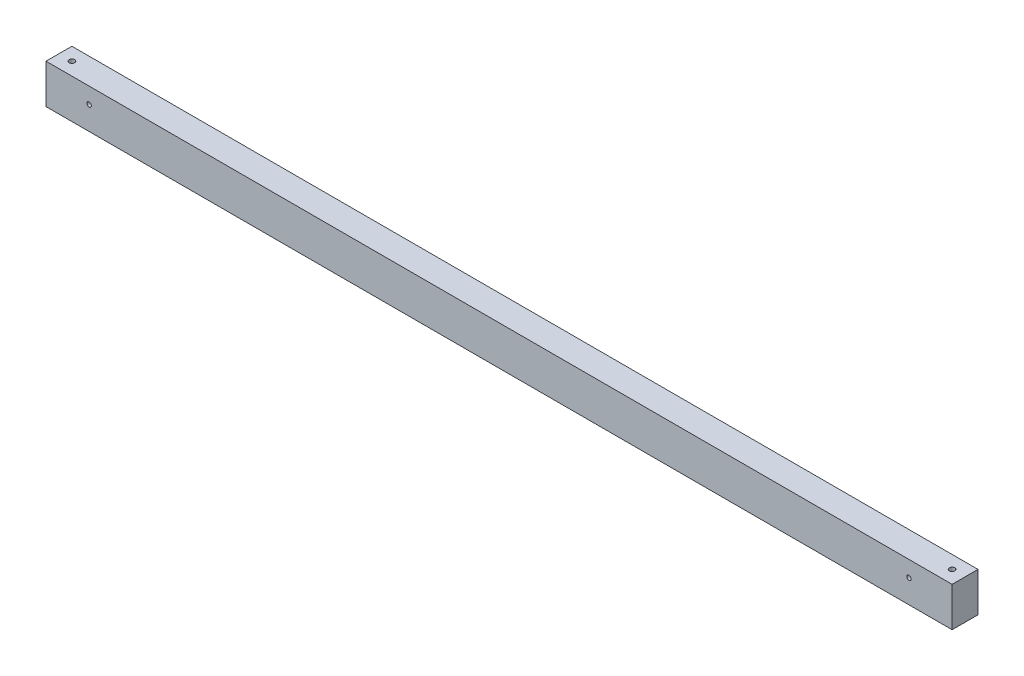
ISO-10303-21;
HEADER;
FILE_DESCRIPTION(('STEP AP214'),'2;1');
FILE_NAME('part.step','',(''),(''),'','','');
FILE_SCHEMA(('AUTOMOTIVE_DESIGN { 1 0 10303 214 1 1 1 1 }'));
ENDSEC;
DATA;
#1=APPLICATION_CONTEXT('core data for automotive mechanical design processes');
#2=APPLICATION_PROTOCOL_DEFINITION('international standard','automotive_design',2000,#1);
#3=PRODUCT_CONTEXT('',#1,'mechanical');
#4=PRODUCT('Part','Part','',(#3));
#5=PRODUCT_RELATED_PRODUCT_CATEGORY('part','',(#4));
#6=PRODUCT_DEFINITION_FORMATION('','',#4);
#7=PRODUCT_DEFINITION_CONTEXT('part definition',#1,'design');
#8=PRODUCT_DEFINITION('design','',#6,#7);
#9=PRODUCT_DEFINITION_SHAPE('','',#8);
#10=(LENGTH_UNIT() NAMED_UNIT(*) SI_UNIT(.MILLI.,.METRE.));
#11=(NAMED_UNIT(*) PLANE_ANGLE_UNIT() SI_UNIT($,.RADIAN.));
#12=(NAMED_UNIT(*) SI_UNIT($,.STERADIAN.) SOLID_ANGLE_UNIT());
#13=UNCERTAINTY_MEASURE_WITH_UNIT(LENGTH_MEASURE(1.E-05),#10,'distance_accuracy_value','');
#14=(GEOMETRIC_REPRESENTATION_CONTEXT(3) GLOBAL_UNCERTAINTY_ASSIGNED_CONTEXT((#13)) GLOBAL_UNIT_ASSIGNED_CONTEXT((#10,
#11,#12)) REPRESENTATION_CONTEXT('',''));
#15=CARTESIAN_POINT('',(0.,0.,0.));
#16=DIRECTION('',(0.,0.,1.));
#17=DIRECTION('',(1.,0.,0.));
#18=AXIS2_PLACEMENT_3D('',#15,#16,#17);
#19=CARTESIAN_POINT('',(-1050.,91.2,-60.0000000000005));
#20=DIRECTION('',(1.,0.,0.));
#21=DIRECTION('',(0.,0.,-1.));
#22=AXIS2_PLACEMENT_3D('',#19,#20,#21);
#23=PLANE('',#22);
#24=DIRECTION('',(0.,0.,1.));
#25=VECTOR('',#24,1.);
#26=CARTESIAN_POINT('',(-1050.,0.,-60.0000000000005));
#27=LINE('',#26,#25);
#28=CARTESIAN_POINT('',(-1050.,0.,-60.0000000000005));
#29=VERTEX_POINT('',#28);
#30=CARTESIAN_POINT('',(-1050.,0.,0.));
#31=VERTEX_POINT('',#30);
#32=EDGE_CURVE('E97',#29,#31,#27,.T.);
#33=ORIENTED_EDGE('',*,*,#32,.T.);
#34=DIRECTION('',(0.,-1.,0.));
#35=VECTOR('',#34,1.);
#36=CARTESIAN_POINT('',(-1050.,91.2,0.));
#37=LINE('',#36,#35);
#38=CARTESIAN_POINT('',(-1050.,91.2,0.));
#39=VERTEX_POINT('',#38);
#40=EDGE_CURVE('E11',#39,#31,#37,.T.);
#41=ORIENTED_EDGE('',*,*,#40,.F.);
#42=DIRECTION('',(0.,0.,1.));
#43=VECTOR('',#42,1.);
#44=CARTESIAN_POINT('',(-1050.,91.2,-60.0000000000005));
#45=LINE('',#44,#43);
#46=CARTESIAN_POINT('',(-1050.,91.2,-60.0000000000005));
#47=VERTEX_POINT('',#46);
#48=EDGE_CURVE('E85',#47,#39,#45,.T.);
#49=ORIENTED_EDGE('',*,*,#48,.F.);
#50=DIRECTION('',(0.,-1.,0.));
#51=VECTOR('',#50,1.);
#52=CARTESIAN_POINT('',(-1050.,91.2,-60.0000000000005));
#53=LINE('',#52,#51);
#54=EDGE_CURVE('E93',#47,#29,#53,.T.);
#55=ORIENTED_EDGE('',*,*,#54,.T.);
#56=EDGE_LOOP('',(#33,#41,#49,#55));
#57=FACE_BOUND('',#56,.T.);
#58=ADVANCED_FACE('F34',(#57),#23,.F.);
#59=CARTESIAN_POINT('',(-1050.,91.2,0.));
#60=DIRECTION('',(0.,0.,-1.));
#61=DIRECTION('',(-1.,0.,0.));
#62=AXIS2_PLACEMENT_3D('',#59,#60,#61);
#63=PLANE('',#62);
#64=CARTESIAN_POINT('',(-950.,54.25,0.));
#65=DIRECTION('',(0.,0.,-1.));
#66=DIRECTION('',(-1.,0.,0.));
#67=AXIS2_PLACEMENT_3D('',#64,#65,#66);
#68=CIRCLE('',#67,5.09999999999998);
#69=CARTESIAN_POINT('',(-955.1,54.25,0.));
#70=VERTEX_POINT('',#69);
#71=EDGE_CURVE('E118',#70,#70,#68,.T.);
#72=ORIENTED_EDGE('',*,*,#71,.T.);
#73=EDGE_LOOP('',(#72));
#74=FACE_BOUND('',#73,.T.);
#75=CARTESIAN_POINT('',(950.,54.25,0.));
#76=DIRECTION('',(0.,0.,-1.));
#77=DIRECTION('',(-1.,0.,0.));
#78=AXIS2_PLACEMENT_3D('',#75,#76,#77);
#79=CIRCLE('',#78,5.09999999999998);
#80=CARTESIAN_POINT('',(944.9,54.25,0.));
#81=VERTEX_POINT('',#80);
#82=EDGE_CURVE('E111',#81,#81,#79,.T.);
#83=ORIENTED_EDGE('',*,*,#82,.T.);
#84=EDGE_LOOP('',(#83));
#85=FACE_BOUND('',#84,.T.);
#86=DIRECTION('',(1.,0.,0.));
#87=VECTOR('',#86,1.);
#88=CARTESIAN_POINT('',(-1050.,0.,0.));
#89=LINE('',#88,#87);
#90=CARTESIAN_POINT('',(1050.,0.,0.));
#91=VERTEX_POINT('',#90);
#92=EDGE_CURVE('E89',#31,#91,#89,.T.);
#93=ORIENTED_EDGE('',*,*,#92,.T.);
#94=DIRECTION('',(0.,-1.,0.));
#95=VECTOR('',#94,1.);
#96=CARTESIAN_POINT('',(1050.,91.2,0.));
#97=LINE('',#96,#95);
#98=CARTESIAN_POINT('',(1050.,91.2,0.));
#99=VERTEX_POINT('',#98);
#100=EDGE_CURVE('E42',#99,#91,#97,.T.);
#101=ORIENTED_EDGE('',*,*,#100,.F.);
#102=DIRECTION('',(1.,0.,0.));
#103=VECTOR('',#102,1.);
#104=CARTESIAN_POINT('',(-1050.,91.2,0.));
#105=LINE('',#104,#103);
#106=EDGE_CURVE('E80',#39,#99,#105,.T.);
#107=ORIENTED_EDGE('',*,*,#106,.F.);
#108=ORIENTED_EDGE('',*,*,#40,.T.);
#109=EDGE_LOOP('',(#93,#101,#107,#108));
#110=FACE_BOUND('',#109,.T.);
#111=ADVANCED_FACE('F88',(#74,#85,#110),#63,.F.);
#112=CARTESIAN_POINT('',(1050.,91.2,-60.));
#113=DIRECTION('',(-1.,0.,0.));
#114=DIRECTION('',(0.,0.,1.));
#115=AXIS2_PLACEMENT_3D('',#112,#113,#114);
#116=PLANE('',#115);
#117=DIRECTION('',(0.,0.,-1.));
#118=VECTOR('',#117,1.);
#119=CARTESIAN_POINT('',(1050.,0.,-60.));
#120=LINE('',#119,#118);
#121=CARTESIAN_POINT('',(1050.,0.,-60.));
#122=VERTEX_POINT('',#121);
#123=EDGE_CURVE('E67',#91,#122,#120,.T.);
#124=ORIENTED_EDGE('',*,*,#123,.T.);
#125=DIRECTION('',(0.,-1.,0.));
#126=VECTOR('',#125,1.);
#127=CARTESIAN_POINT('',(1050.,91.2,-60.));
#128=LINE('',#127,#126);
#129=CARTESIAN_POINT('',(1050.,91.2,-60.));
#130=VERTEX_POINT('',#129);
#131=EDGE_CURVE('E90',#130,#122,#128,.T.);
#132=ORIENTED_EDGE('',*,*,#131,.F.);
#133=DIRECTION('',(0.,0.,-1.));
#134=VECTOR('',#133,1.);
#135=CARTESIAN_POINT('',(1050.,91.2,-60.));
#136=LINE('',#135,#134);
#137=EDGE_CURVE('E83',#99,#130,#136,.T.);
#138=ORIENTED_EDGE('',*,*,#137,.F.);
#139=ORIENTED_EDGE('',*,*,#100,.T.);
#140=EDGE_LOOP('',(#124,#132,#138,#139));
#141=FACE_BOUND('',#140,.T.);
#142=ADVANCED_FACE('F91',(#141),#116,.F.);
#143=CARTESIAN_POINT('',(-1050.,91.2,-60.0000000000005));
#144=DIRECTION('',(0.,0.,1.));
#145=DIRECTION('',(1.,0.,0.));
#146=AXIS2_PLACEMENT_3D('',#143,#144,#145);
#147=PLANE('',#146);
#148=CARTESIAN_POINT('',(-950.,54.25,-60.0000000000005));
#149=DIRECTION('',(0.,0.,-1.));
#150=DIRECTION('',(-1.,0.,0.));
#151=AXIS2_PLACEMENT_3D('',#148,#149,#150);
#152=CIRCLE('',#151,5.09999999999998);
#153=CARTESIAN_POINT('',(-955.1,54.25,-60.0000000000005));
#154=VERTEX_POINT('',#153);
#155=EDGE_CURVE('E100',#154,#154,#152,.T.);
#156=ORIENTED_EDGE('',*,*,#155,.F.);
#157=EDGE_LOOP('',(#156));
#158=FACE_BOUND('',#157,.T.);
#159=CARTESIAN_POINT('',(950.,54.25,-60.0000000000005));
#160=DIRECTION('',(0.,0.,-1.));
#161=DIRECTION('',(-1.,0.,0.));
#162=AXIS2_PLACEMENT_3D('',#159,#160,#161);
#163=CIRCLE('',#162,5.09999999999998);
#164=CARTESIAN_POINT('',(944.9,54.25,-60.0000000000005));
#165=VERTEX_POINT('',#164);
#166=EDGE_CURVE('E114',#165,#165,#163,.T.);
#167=ORIENTED_EDGE('',*,*,#166,.F.);
#168=EDGE_LOOP('',(#167));
#169=FACE_BOUND('',#168,.T.);
#170=DIRECTION('',(-1.,0.,0.));
#171=VECTOR('',#170,1.);
#172=CARTESIAN_POINT('',(-1050.,0.,-60.0000000000005));
#173=LINE('',#172,#171);
#174=EDGE_CURVE('E73',#122,#29,#173,.T.);
#175=ORIENTED_EDGE('',*,*,#174,.T.);
#176=ORIENTED_EDGE('',*,*,#54,.F.);
#177=DIRECTION('',(-1.,0.,0.));
#178=VECTOR('',#177,1.);
#179=CARTESIAN_POINT('',(-1050.,91.2,-60.0000000000005));
#180=LINE('',#179,#178);
#181=EDGE_CURVE('E50',#130,#47,#180,.T.);
#182=ORIENTED_EDGE('',*,*,#181,.F.);
#183=ORIENTED_EDGE('',*,*,#131,.T.);
#184=EDGE_LOOP('',(#175,#176,#182,#183));
#185=FACE_BOUND('',#184,.T.);
#186=ADVANCED_FACE('F105',(#158,#169,#185),#147,.F.);
#187=CARTESIAN_POINT('',(0.,91.2,0.));
#188=DIRECTION('',(0.,1.,0.));
#189=DIRECTION('',(0.,0.,1.));
#190=AXIS2_PLACEMENT_3D('',#187,#188,#189);
#191=PLANE('',#190);
#192=CARTESIAN_POINT('',(1020.,91.2,-30.));
#193=DIRECTION('',(0.,1.,0.));
#194=DIRECTION('',(0.,0.,1.));
#195=AXIS2_PLACEMENT_3D('',#192,#193,#194);
#196=CIRCLE('',#195,6.35000000000016);
#197=CARTESIAN_POINT('',(1020.,91.2,-23.6499999999998));
#198=VERTEX_POINT('',#197);
#199=EDGE_CURVE('E126',#198,#198,#196,.T.);
#200=ORIENTED_EDGE('',*,*,#199,.F.);
#201=EDGE_LOOP('',(#200));
#202=FACE_BOUND('',#201,.T.);
#203=CARTESIAN_POINT('',(-1020.,91.2,-30.));
#204=DIRECTION('',(0.,1.,0.));
#205=DIRECTION('',(0.,0.,1.));
#206=AXIS2_PLACEMENT_3D('',#203,#204,#205);
#207=CIRCLE('',#206,6.35000000000016);
#208=CARTESIAN_POINT('',(-1020.,91.2,-23.6499999999998));
#209=VERTEX_POINT('',#208);
#210=EDGE_CURVE('E127',#209,#209,#207,.T.);
#211=ORIENTED_EDGE('',*,*,#210,.F.);
#212=EDGE_LOOP('',(#211));
#213=FACE_BOUND('',#212,.T.);
#214=ORIENTED_EDGE('',*,*,#48,.T.);
#215=ORIENTED_EDGE('',*,*,#106,.T.);
#216=ORIENTED_EDGE('',*,*,#137,.T.);
#217=ORIENTED_EDGE('',*,*,#181,.T.);
#218=EDGE_LOOP('',(#214,#215,#216,#217));
#219=FACE_BOUND('',#218,.T.);
#220=ADVANCED_FACE('F81',(#202,#213,#219),#191,.T.);
#221=CARTESIAN_POINT('',(0.,0.,0.));
#222=DIRECTION('',(0.,1.,0.));
#223=DIRECTION('',(0.,0.,1.));
#224=AXIS2_PLACEMENT_3D('',#221,#222,#223);
#225=PLANE('',#224);
#226=CARTESIAN_POINT('',(1020.,0.,-30.));
#227=DIRECTION('',(0.,1.,0.));
#228=DIRECTION('',(0.,0.,1.));
#229=AXIS2_PLACEMENT_3D('',#226,#227,#228);
#230=CIRCLE('',#229,6.35000000000016);
#231=CARTESIAN_POINT('',(1020.,0.,-23.6499999999998));
#232=VERTEX_POINT('',#231);
#233=EDGE_CURVE('E115',#232,#232,#230,.F.);
#234=ORIENTED_EDGE('',*,*,#233,.F.);
#235=EDGE_LOOP('',(#234));
#236=FACE_BOUND('',#235,.T.);
#237=CARTESIAN_POINT('',(-1020.,0.,-30.));
#238=DIRECTION('',(0.,1.,0.));
#239=DIRECTION('',(0.,0.,1.));
#240=AXIS2_PLACEMENT_3D('',#237,#238,#239);
#241=CIRCLE('',#240,6.35000000000016);
#242=CARTESIAN_POINT('',(-1020.,0.,-23.6499999999998));
#243=VERTEX_POINT('',#242);
#244=EDGE_CURVE('E123',#243,#243,#241,.F.);
#245=ORIENTED_EDGE('',*,*,#244,.F.);
#246=EDGE_LOOP('',(#245));
#247=FACE_BOUND('',#246,.T.);
#248=ORIENTED_EDGE('',*,*,#32,.F.);
#249=ORIENTED_EDGE('',*,*,#174,.F.);
#250=ORIENTED_EDGE('',*,*,#123,.F.);
#251=ORIENTED_EDGE('',*,*,#92,.F.);
#252=EDGE_LOOP('',(#248,#249,#250,#251));
#253=FACE_BOUND('',#252,.T.);
#254=ADVANCED_FACE('F108',(#236,#247,#253),#225,.F.);
#255=CARTESIAN_POINT('',(950.,54.25,-60.0000000000005));
#256=DIRECTION('',(0.,0.,1.));
#257=DIRECTION('',(1.,0.,0.));
#258=AXIS2_PLACEMENT_3D('',#255,#256,#257);
#259=CYLINDRICAL_SURFACE('',#258,5.09999999999998);
#260=ORIENTED_EDGE('',*,*,#166,.T.);
#261=EDGE_LOOP('',(#260));
#262=FACE_BOUND('',#261,.T.);
#263=ORIENTED_EDGE('',*,*,#82,.F.);
#264=EDGE_LOOP('',(#263));
#265=FACE_BOUND('',#264,.T.);
#266=ADVANCED_FACE('F153',(#262,#265),#259,.F.);
#267=CARTESIAN_POINT('',(-950.,54.25,-60.0000000000005));
#268=DIRECTION('',(0.,0.,1.));
#269=DIRECTION('',(1.,0.,0.));
#270=AXIS2_PLACEMENT_3D('',#267,#268,#269);
#271=CYLINDRICAL_SURFACE('',#270,5.09999999999998);
#272=ORIENTED_EDGE('',*,*,#155,.T.);
#273=EDGE_LOOP('',(#272));
#274=FACE_BOUND('',#273,.T.);
#275=ORIENTED_EDGE('',*,*,#71,.F.);
#276=EDGE_LOOP('',(#275));
#277=FACE_BOUND('',#276,.T.);
#278=ADVANCED_FACE('F144',(#274,#277),#271,.F.);
#279=CARTESIAN_POINT('',(-1020.,-17.9605122421387,-30.));
#280=DIRECTION('',(0.,1.,0.));
#281=DIRECTION('',(0.,0.,1.));
#282=AXIS2_PLACEMENT_3D('',#279,#280,#281);
#283=CYLINDRICAL_SURFACE('',#282,6.35000000000016);
#284=ORIENTED_EDGE('',*,*,#244,.T.);
#285=EDGE_LOOP('',(#284));
#286=FACE_BOUND('',#285,.T.);
#287=ORIENTED_EDGE('',*,*,#210,.T.);
#288=EDGE_LOOP('',(#287));
#289=FACE_BOUND('',#288,.T.);
#290=ADVANCED_FACE('F142',(#286,#289),#283,.F.);
#291=CARTESIAN_POINT('',(1020.,-17.9605122421387,-30.));
#292=DIRECTION('',(0.,1.,0.));
#293=DIRECTION('',(0.,0.,1.));
#294=AXIS2_PLACEMENT_3D('',#291,#292,#293);
#295=CYLINDRICAL_SURFACE('',#294,6.35000000000016);
#296=ORIENTED_EDGE('',*,*,#233,.T.);
#297=EDGE_LOOP('',(#296));
#298=FACE_BOUND('',#297,.T.);
#299=ORIENTED_EDGE('',*,*,#199,.T.);
#300=EDGE_LOOP('',(#299));
#301=FACE_BOUND('',#300,.T.);
#302=ADVANCED_FACE('F135',(#298,#301),#295,.F.);
#303=CLOSED_SHELL('',(#58,#111,#142,#186,#220,#254,#266,#278,#290,#302));
#304=MANIFOLD_SOLID_BREP('B2',#303);
#305=ADVANCED_BREP_SHAPE_REPRESENTATION('',(#18,#304),#14);
#306=SHAPE_DEFINITION_REPRESENTATION(#9,#305);
ENDSEC;
END-ISO-10303-21;
